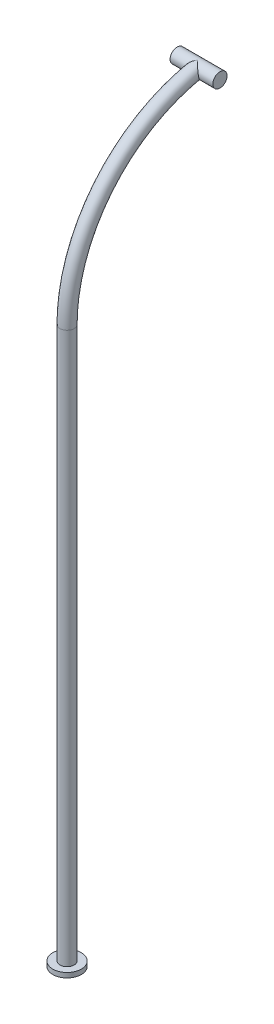
ISO-10303-21;
HEADER;
FILE_DESCRIPTION(('STEP AP214'),'2;1');
FILE_NAME('part.step','',(''),(''),'','','');
FILE_SCHEMA(('AUTOMOTIVE_DESIGN { 1 0 10303 214 1 1 1 1 }'));
ENDSEC;
DATA;
#1=APPLICATION_CONTEXT('core data for automotive mechanical design processes');
#2=APPLICATION_PROTOCOL_DEFINITION('international standard','automotive_design',2000,#1);
#3=PRODUCT_CONTEXT('',#1,'mechanical');
#4=PRODUCT('Part','Part','',(#3));
#5=PRODUCT_RELATED_PRODUCT_CATEGORY('part','',(#4));
#6=PRODUCT_DEFINITION_FORMATION('','',#4);
#7=PRODUCT_DEFINITION_CONTEXT('part definition',#1,'design');
#8=PRODUCT_DEFINITION('design','',#6,#7);
#9=PRODUCT_DEFINITION_SHAPE('','',#8);
#10=(LENGTH_UNIT() NAMED_UNIT(*) SI_UNIT(.MILLI.,.METRE.));
#11=(NAMED_UNIT(*) PLANE_ANGLE_UNIT() SI_UNIT($,.RADIAN.));
#12=(NAMED_UNIT(*) SI_UNIT($,.STERADIAN.) SOLID_ANGLE_UNIT());
#13=UNCERTAINTY_MEASURE_WITH_UNIT(LENGTH_MEASURE(1.E-05),#10,'distance_accuracy_value','');
#14=(GEOMETRIC_REPRESENTATION_CONTEXT(3) GLOBAL_UNCERTAINTY_ASSIGNED_CONTEXT((#13)) GLOBAL_UNIT_ASSIGNED_CONTEXT((#10,
#11,#12)) REPRESENTATION_CONTEXT('',''));
#15=CARTESIAN_POINT('',(0.,0.,0.));
#16=DIRECTION('',(0.,0.,1.));
#17=DIRECTION('',(1.,0.,0.));
#18=AXIS2_PLACEMENT_3D('',#15,#16,#17);
#19=CARTESIAN_POINT('',(0.,116.,0.));
#20=DIRECTION('',(0.,-1.,0.));
#21=DIRECTION('',(0.,0.,-1.));
#22=AXIS2_PLACEMENT_3D('',#19,#20,#21);
#23=CYLINDRICAL_SURFACE('',#22,1.5);
#24=CARTESIAN_POINT('',(0.,116.,0.));
#25=DIRECTION('',(0.,1.,0.));
#26=DIRECTION('',(0.,0.,1.));
#27=AXIS2_PLACEMENT_3D('',#24,#25,#26);
#28=CIRCLE('',#27,1.5);
#29=CARTESIAN_POINT('',(0.,116.,-1.5));
#30=VERTEX_POINT('',#29);
#31=EDGE_CURVE('E11',#30,#30,#28,.T.);
#32=CARTESIAN_POINT('',(0.,0.,0.));
#33=DIRECTION('',(0.,1.,0.));
#34=DIRECTION('',(0.,0.,1.));
#35=AXIS2_PLACEMENT_3D('',#32,#33,#34);
#36=CIRCLE('',#35,1.5);
#37=CARTESIAN_POINT('',(0.,0.,-1.5));
#38=VERTEX_POINT('',#37);
#39=EDGE_CURVE('E35',#38,#38,#36,.T.);
#40=CARTESIAN_POINT('',(0.,116.,-1.5));
#41=CARTESIAN_POINT('',(0.,114.791666666667,-1.5));
#42=CARTESIAN_POINT('',(0.,113.583333333333,-1.5));
#43=CARTESIAN_POINT('',(0.,111.166666666667,-1.5));
#44=CARTESIAN_POINT('',(0.,109.958333333333,-1.5));
#45=CARTESIAN_POINT('',(0.,107.541666666667,-1.5));
#46=CARTESIAN_POINT('',(0.,106.333333333333,-1.5));
#47=CARTESIAN_POINT('',(0.,103.916666666667,-1.5));
#48=CARTESIAN_POINT('',(0.,102.708333333333,-1.5));
#49=CARTESIAN_POINT('',(0.,100.291666666667,-1.5));
#50=CARTESIAN_POINT('',(0.,99.0833333333333,-1.5));
#51=CARTESIAN_POINT('',(0.,96.6666666666667,-1.5));
#52=CARTESIAN_POINT('',(0.,95.4583333333333,-1.5));
#53=CARTESIAN_POINT('',(0.,93.0416666666667,-1.5));
#54=CARTESIAN_POINT('',(0.,91.8333333333333,-1.5));
#55=CARTESIAN_POINT('',(0.,89.4166666666667,-1.5));
#56=CARTESIAN_POINT('',(0.,88.2083333333333,-1.5));
#57=CARTESIAN_POINT('',(0.,85.7916666666667,-1.5));
#58=CARTESIAN_POINT('',(0.,84.5833333333333,-1.5));
#59=CARTESIAN_POINT('',(0.,82.1666666666667,-1.5));
#60=CARTESIAN_POINT('',(0.,80.9583333333333,-1.5));
#61=CARTESIAN_POINT('',(0.,78.5416666666667,-1.5));
#62=CARTESIAN_POINT('',(0.,77.3333333333333,-1.5));
#63=CARTESIAN_POINT('',(0.,74.9166666666667,-1.5));
#64=CARTESIAN_POINT('',(0.,73.7083333333333,-1.5));
#65=CARTESIAN_POINT('',(0.,71.2916666666667,-1.5));
#66=CARTESIAN_POINT('',(0.,70.0833333333333,-1.5));
#67=CARTESIAN_POINT('',(0.,67.6666666666667,-1.5));
#68=CARTESIAN_POINT('',(0.,66.4583333333333,-1.5));
#69=CARTESIAN_POINT('',(0.,64.0416666666667,-1.5));
#70=CARTESIAN_POINT('',(0.,62.8333333333333,-1.5));
#71=CARTESIAN_POINT('',(0.,60.4166666666667,-1.5));
#72=CARTESIAN_POINT('',(0.,59.2083333333333,-1.5));
#73=CARTESIAN_POINT('',(0.,56.7916666666667,-1.5));
#74=CARTESIAN_POINT('',(0.,55.5833333333333,-1.5));
#75=CARTESIAN_POINT('',(0.,53.1666666666667,-1.5));
#76=CARTESIAN_POINT('',(0.,51.9583333333333,-1.5));
#77=CARTESIAN_POINT('',(0.,49.5416666666667,-1.5));
#78=CARTESIAN_POINT('',(0.,48.3333333333333,-1.5));
#79=CARTESIAN_POINT('',(0.,45.9166666666667,-1.5));
#80=CARTESIAN_POINT('',(0.,44.7083333333333,-1.5));
#81=CARTESIAN_POINT('',(0.,42.2916666666667,-1.5));
#82=CARTESIAN_POINT('',(0.,41.0833333333333,-1.5));
#83=CARTESIAN_POINT('',(0.,38.6666666666667,-1.5));
#84=CARTESIAN_POINT('',(0.,37.4583333333333,-1.5));
#85=CARTESIAN_POINT('',(0.,35.0416666666667,-1.5));
#86=CARTESIAN_POINT('',(0.,33.8333333333333,-1.5));
#87=CARTESIAN_POINT('',(0.,31.4166666666667,-1.5));
#88=CARTESIAN_POINT('',(0.,30.2083333333333,-1.5));
#89=CARTESIAN_POINT('',(0.,27.7916666666667,-1.5));
#90=CARTESIAN_POINT('',(0.,26.5833333333333,-1.5));
#91=CARTESIAN_POINT('',(0.,24.1666666666667,-1.5));
#92=CARTESIAN_POINT('',(0.,22.9583333333333,-1.5));
#93=CARTESIAN_POINT('',(0.,20.5416666666667,-1.5));
#94=CARTESIAN_POINT('',(0.,19.3333333333333,-1.5));
#95=CARTESIAN_POINT('',(0.,16.9166666666667,-1.5));
#96=CARTESIAN_POINT('',(0.,15.7083333333333,-1.5));
#97=CARTESIAN_POINT('',(0.,13.2916666666667,-1.5));
#98=CARTESIAN_POINT('',(0.,12.0833333333333,-1.5));
#99=CARTESIAN_POINT('',(0.,9.66666666666667,-1.5));
#100=CARTESIAN_POINT('',(0.,8.45833333333334,-1.5));
#101=CARTESIAN_POINT('',(0.,6.04166666666667,-1.5));
#102=CARTESIAN_POINT('',(0.,4.83333333333334,-1.5));
#103=CARTESIAN_POINT('',(0.,2.41666666666667,-1.5));
#104=CARTESIAN_POINT('',(0.,1.20833333333333,-1.5));
#105=CARTESIAN_POINT('',(0.,0.,-1.5));
#106=B_SPLINE_CURVE_WITH_KNOTS('',3,(#40,#41,#42,#43,#44,#45,#46,#47,#48,#49,#50,#51,#52,#53,
#54,#55,#56,#57,#58,#59,#60,#61,#62,#63,#64,#65,#66,#67,#68,#69,#70,#71,#72,#73,#74,#75,#76,#77,
#78,#79,#80,#81,#82,#83,#84,#85,#86,#87,#88,#89,#90,#91,#92,#93,#94,#95,#96,#97,#98,#99,#100,
#101,#102,#103,#104,#105),.UNSPECIFIED.,.F.,.F.,(4,2,2,2,2,2,2,2,2,2,2,2,2,2,2,2,2,2,2,2,2,2,2,
2,2,2,2,2,2,2,2,2,4),(0.,3.625,7.25000000000001,10.875,14.5,18.125,21.75,25.375,29.,32.625,
36.25,39.875,43.5,47.125,50.75,54.375,58.,61.625,65.25,68.875,72.5,76.125,79.75,83.375,87.,
90.625,94.25,97.875,101.5,105.125,108.75,112.375,116.),.UNSPECIFIED.);
#107=EDGE_CURVE('BSEAM32',#30,#38,#106,.T.);
#108=ORIENTED_EDGE('',*,*,#31,.F.);
#109=ORIENTED_EDGE('',*,*,#39,.T.);
#110=ORIENTED_EDGE('',*,*,#107,.T.);
#111=ORIENTED_EDGE('',*,*,#107,.F.);
#112=EDGE_LOOP('',(#108,#110,#109,#111));
#113=FACE_BOUND('',#112,.T.);
#114=ADVANCED_FACE('F32',(#113),#23,.T.);
#115=CARTESIAN_POINT('',(0.,-1.,0.));
#116=DIRECTION('',(0.,1.,0.));
#117=DIRECTION('',(0.,0.,1.));
#118=AXIS2_PLACEMENT_3D('',#115,#116,#117);
#119=CYLINDRICAL_SURFACE('',#118,3.);
#120=CARTESIAN_POINT('',(0.,-1.,0.));
#121=DIRECTION('',(0.,-1.,0.));
#122=DIRECTION('',(0.,0.,-1.));
#123=AXIS2_PLACEMENT_3D('',#120,#121,#122);
#124=CIRCLE('',#123,3.);
#125=CARTESIAN_POINT('',(0.,-1.,-3.));
#126=VERTEX_POINT('',#125);
#127=EDGE_CURVE('E57',#126,#126,#124,.T.);
#128=ORIENTED_EDGE('',*,*,#127,.F.);
#129=EDGE_LOOP('',(#128));
#130=FACE_BOUND('',#129,.T.);
#131=CARTESIAN_POINT('',(0.,0.,0.));
#132=DIRECTION('',(0.,-1.,0.));
#133=DIRECTION('',(0.,0.,-1.));
#134=AXIS2_PLACEMENT_3D('',#131,#132,#133);
#135=CIRCLE('',#134,3.);
#136=CARTESIAN_POINT('',(0.,0.,-3.));
#137=VERTEX_POINT('',#136);
#138=EDGE_CURVE('E54',#137,#137,#135,.T.);
#139=ORIENTED_EDGE('',*,*,#138,.T.);
#140=EDGE_LOOP('',(#139));
#141=FACE_BOUND('',#140,.T.);
#142=ADVANCED_FACE('F87',(#130,#141),#119,.T.);
#143=CARTESIAN_POINT('',(0.,-1.,0.));
#144=DIRECTION('',(0.,-1.,0.));
#145=DIRECTION('',(0.,0.,-1.));
#146=AXIS2_PLACEMENT_3D('',#143,#144,#145);
#147=PLANE('',#146);
#148=ORIENTED_EDGE('',*,*,#127,.T.);
#149=EDGE_LOOP('',(#148));
#150=FACE_BOUND('',#149,.T.);
#151=ADVANCED_FACE('F92',(#150),#147,.T.);
#152=CARTESIAN_POINT('',(0.,0.,0.));
#153=DIRECTION('',(0.,-1.,0.));
#154=DIRECTION('',(0.,0.,-1.));
#155=AXIS2_PLACEMENT_3D('',#152,#153,#154);
#156=PLANE('',#155);
#157=ORIENTED_EDGE('',*,*,#39,.F.);
#158=EDGE_LOOP('',(#157));
#159=FACE_BOUND('',#158,.T.);
#160=ORIENTED_EDGE('',*,*,#138,.F.);
#161=EDGE_LOOP('',(#160));
#162=FACE_BOUND('',#161,.T.);
#163=ADVANCED_FACE('F105',(#159,#162),#156,.F.);
#164=CARTESIAN_POINT('',(0.,116.,-33.5));
#165=DIRECTION('',(1.,0.,0.));
#166=DIRECTION('',(0.,0.,-1.));
#167=AXIS2_PLACEMENT_3D('',#164,#165,#166);
#168=TOROIDAL_SURFACE('',#167,33.5,1.5);
#169=CARTESIAN_POINT('',(0.,150.468271355427,-27.4223137816575));
#170=CARTESIAN_POINT('',(-0.0018455700807971,150.467943771681,-27.4204560058939));
#171=CARTESIAN_POINT('',(-0.00369119618615408,150.467612681176,-27.418598790246));
#172=CARTESIAN_POINT('',(-0.11723675298671,150.447028324668,-27.3043782216821));
#173=CARTESIAN_POINT('',(-0.229114545353066,150.413934769553,-27.1940972541607));
#174=CARTESIAN_POINT('',(-0.450167280180578,150.321985418649,-26.9812724865205));
#175=CARTESIAN_POINT('',(-0.559335695353365,150.263072789314,-26.8787463436305));
#176=CARTESIAN_POINT('',(-0.741816339629492,150.138437283195,-26.7126643590827));
#177=CARTESIAN_POINT('',(-0.816740553529646,150.079030491823,-26.6461399004851));
#178=CARTESIAN_POINT('',(-0.960834204534878,149.945645295398,-26.5221694214755));
#179=CARTESIAN_POINT('',(-1.0300161261433,149.871699746004,-26.4647034481776));
#180=CARTESIAN_POINT('',(-1.14273518511408,149.730028512423,-26.3754993125735));
#181=CARTESIAN_POINT('',(-1.18826908749948,149.665666180124,-26.3409542883607));
#182=CARTESIAN_POINT('',(-1.27266401355297,149.528928810461,-26.2805509156627));
#183=CARTESIAN_POINT('',(-1.31153339372175,149.456563997418,-26.2546816493207));
#184=CARTESIAN_POINT('',(-1.37321158242012,149.320304931743,-26.2180316917124));
#185=CARTESIAN_POINT('',(-1.39767927334744,149.257707811747,-26.2052465965705));
#186=CARTESIAN_POINT('',(-1.43953985941923,149.129078400923,-26.1877433182874));
#187=CARTESIAN_POINT('',(-1.45693745222111,149.063048424035,-26.1830197720302));
#188=CARTESIAN_POINT('',(-1.48346461159684,148.928763457495,-26.1825679557935));
#189=CARTESIAN_POINT('',(-1.49253356956041,148.86049584431,-26.1869048849103));
#190=CARTESIAN_POINT('',(-1.50129804899405,148.724622755612,-26.2050515110252));
#191=CARTESIAN_POINT('',(-1.50099879563853,148.657016932031,-26.2188559232768));
#192=CARTESIAN_POINT('',(-1.49157787227115,148.532726366524,-26.2532405987497));
#193=CARTESIAN_POINT('',(-1.48348741594787,148.47568652385,-26.2728448592982));
#194=CARTESIAN_POINT('',(-1.46048849656692,148.365551024773,-26.3181302422252));
#195=CARTESIAN_POINT('',(-1.44557906022225,148.312455932671,-26.3438122318377));
#196=CARTESIAN_POINT('',(-1.40922059833972,148.209559484664,-26.4010538738837));
#197=CARTESIAN_POINT('',(-1.38757698661735,148.15991860127,-26.4327757576798));
#198=CARTESIAN_POINT('',(-1.33901214455985,148.066363504146,-26.5003006615747));
#199=CARTESIAN_POINT('',(-1.31208831928666,148.022452123898,-26.5361056846791));
#200=CARTESIAN_POINT('',(-1.23810795998544,147.918053132926,-26.6311203721736));
#201=CARTESIAN_POINT('',(-1.18807950143996,147.86158563168,-26.6924448961051));
#202=CARTESIAN_POINT('',(-1.08086971168539,147.761769125044,-26.8194203058563));
#203=CARTESIAN_POINT('',(-1.02366946922008,147.718455879489,-26.8850824044393));
#204=CARTESIAN_POINT('',(-0.880243458258788,147.628803488579,-27.0457516762444));
#205=CARTESIAN_POINT('',(-0.791633956613812,147.58832353005,-27.1418880756446));
#206=CARTESIAN_POINT('',(-0.608933600065409,147.528355639259,-27.3352854637372));
#207=CARTESIAN_POINT('',(-0.514839483169954,147.508880336669,-27.4325470935278));
#208=CARTESIAN_POINT('',(-0.351278026015448,147.491836263022,-27.5983272439971));
#209=CARTESIAN_POINT('',(-0.282486170635539,147.489587062431,-27.6670902088788));
#210=CARTESIAN_POINT('',(-0.144296015824541,147.494370639898,-27.8034873341362));
#211=CARTESIAN_POINT('',(-0.0748990069601948,147.501386977978,-27.871123278779));
#212=CARTESIAN_POINT('',(-0.00369302848105099,147.513224541409,-27.9397031814825));
#213=CARTESIAN_POINT('',(-0.00184649713801543,147.513534720144,-27.9414810469467));
#214=CARTESIAN_POINT('',(0.,147.513848096391,-27.9432583146583));
#215=B_SPLINE_CURVE_WITH_KNOTS('',3,(#169,#170,#171,#172,#173,#174,#175,#176,#177,#178,#179,
#180,#181,#182,#183,#184,#185,#186,#187,#188,#189,#190,#191,#192,#193,#194,#195,#196,#197,#198,
#199,#200,#201,#202,#203,#204,#205,#206,#207,#208,#209,#210,#211,#212,#213,#214),.UNSPECIFIED.,
.F.,.F.,(4,2,2,2,2,2,2,2,2,2,2,2,2,2,2,2,2,2,2,2,2,2,4),(0.,0.00791749209999727,
0.487082614778096,0.96730782641132,1.31561813730152,1.66315017769124,1.92052040451129,
2.17756552214118,2.38200785095782,2.58631411709557,2.79209563160859,2.99776237232942,
3.17948418892788,3.36123195115241,3.54881473479254,3.73648993723761,4.0265163370424,
4.31732425781116,4.72572981565765,5.13438080279551,5.4258473390426,5.71679741627866,
5.72454338913383),.UNSPECIFIED.);
#216=CARTESIAN_POINT('',(0.,150.468271355427,-27.4223137816575));
#217=VERTEX_POINT('',#216);
#218=CARTESIAN_POINT('',(0.,147.513848096391,-27.9432583146583));
#219=VERTEX_POINT('',#218);
#220=EDGE_CURVE('E47',#217,#219,#215,.T.);
#221=ORIENTED_EDGE('',*,*,#220,.T.);
#222=CARTESIAN_POINT('',(0.,147.513848096391,-27.9432583146583));
#223=CARTESIAN_POINT('',(0.0018464531636213,147.513534732483,-27.9414810884643));
#224=CARTESIAN_POINT('',(0.00369298482771931,147.513224553499,-27.9397032227249));
#225=CARTESIAN_POINT('',(0.124339664345886,147.493167456668,-27.8235060438266));
#226=CARTESIAN_POINT('',(0.243429358936764,147.486611368485,-27.7064697093279));
#227=CARTESIAN_POINT('',(0.419281094860855,147.497725754174,-27.529633837264));
#228=CARTESIAN_POINT('',(0.477525527230344,147.504950407235,-27.470379105977));
#229=CARTESIAN_POINT('',(0.59256173439493,147.526785695943,-27.3518348200178));
#230=CARTESIAN_POINT('',(0.649354393664904,147.541391716195,-27.2925453102026));
#231=CARTESIAN_POINT('',(0.779559264264115,147.584693518914,-27.1546016703881));
#232=CARTESIAN_POINT('',(0.852161576340586,147.616470992009,-27.0761178562885));
#233=CARTESIAN_POINT('',(0.991398120760106,147.695526874957,-26.9218099852698));
#234=CARTESIAN_POINT('',(1.05804550204984,147.742770001864,-26.8459803051235));
#235=CARTESIAN_POINT('',(1.16657305008167,147.840293809682,-26.7181823981691));
#236=CARTESIAN_POINT('',(1.21045261959584,147.886779988639,-26.6650320912657));
#237=CARTESIAN_POINT('',(1.29131121555191,147.98989534437,-26.5634613673116));
#238=CARTESIAN_POINT('',(1.3282988889806,148.046511633973,-26.5150350601134));
#239=CARTESIAN_POINT('',(1.38661289528443,148.157487641821,-26.4342340343271));
#240=CARTESIAN_POINT('',(1.40959162237487,148.210042499447,-26.4005846773196));
#241=CARTESIAN_POINT('',(1.4483829945195,148.320996280183,-26.3392751544075));
#242=CARTESIAN_POINT('',(1.4642007337524,148.379391012707,-26.3116107382776));
#243=CARTESIAN_POINT('',(1.48765459823308,148.501111572783,-26.2635419664262));
#244=CARTESIAN_POINT('',(1.49524066188499,148.564465087924,-26.2431825320193));
#245=CARTESIAN_POINT('',(1.50147440979303,148.693736749745,-26.2110422317556));
#246=CARTESIAN_POINT('',(1.50012449635727,148.759654202411,-26.1992590612397));
#247=CARTESIAN_POINT('',(1.4892575363322,148.885267016529,-26.1853170707429));
#248=CARTESIAN_POINT('',(1.48054487648359,148.944946113396,-26.1823360150494));
#249=CARTESIAN_POINT('',(1.45664817664342,149.062910520598,-26.1833464835934));
#250=CARTESIAN_POINT('',(1.44146305880287,149.121195597081,-26.1873391695012));
#251=CARTESIAN_POINT('',(1.40446636317129,149.238464215033,-26.2020819647632));
#252=CARTESIAN_POINT('',(1.38232264524451,149.297293577946,-26.2132091356558));
#253=CARTESIAN_POINT('',(1.33290006633376,149.411157373233,-26.2416169118734));
#254=CARTESIAN_POINT('',(1.30561829303529,149.466189629069,-26.2589010120006));
#255=CARTESIAN_POINT('',(1.23093165457258,149.600816134184,-26.3095355472436));
#256=CARTESIAN_POINT('',(1.18065855168603,149.677467383282,-26.3465096272665));
#257=CARTESIAN_POINT('',(1.07322474920916,149.820071157484,-26.4299496642385));
#258=CARTESIAN_POINT('',(1.01604682904675,149.885995929004,-26.4764395627449));
#259=CARTESIAN_POINT('',(0.875437348617189,150.029122075187,-26.5947210428979));
#260=CARTESIAN_POINT('',(0.789984780647424,150.101790670277,-26.6695851310483));
#261=CARTESIAN_POINT('',(0.613981627037371,150.228208028432,-26.8285119161098));
#262=CARTESIAN_POINT('',(0.52342817789593,150.28194603908,-26.9125798052879));
#263=CARTESIAN_POINT('',(0.361513639747116,150.360554037092,-27.0662981580287));
#264=CARTESIAN_POINT('',(0.290706467903815,150.389249624625,-27.1346261765933));
#265=CARTESIAN_POINT('',(0.148428259977776,150.436127801861,-27.273927570059));
#266=CARTESIAN_POINT('',(0.0769587187554034,150.454330015801,-27.3448957410066));
#267=CARTESIAN_POINT('',(0.00369121283488572,150.467612683353,-27.4185987725135));
#268=CARTESIAN_POINT('',(0.0018455866538151,150.467943774064,-27.4204559882025));
#269=CARTESIAN_POINT('',(0.,150.468271355427,-27.4223137816575));
#270=B_SPLINE_CURVE_WITH_KNOTS('',3,(#222,#223,#224,#225,#226,#227,#228,#229,#230,#231,#232,
#233,#234,#235,#236,#237,#238,#239,#240,#241,#242,#243,#244,#245,#246,#247,#248,#249,#250,#251,
#252,#253,#254,#255,#256,#257,#258,#259,#260,#261,#262,#263,#264,#265,#266,#267,#268,#269),
.UNSPECIFIED.,.F.,.F.,(4,2,2,2,2,2,2,2,2,2,2,2,2,2,2,2,2,2,2,2,2,2,2,4),(0.,0.00774597285516229,
0.506078780252799,0.756046703031556,1.00585851983455,1.33940265139592,1.67219108592526,
1.9207591550255,2.16901322421771,2.36771980543343,2.56628480791592,2.76605074596186,
2.96576298200791,3.14611560612234,3.32649827583791,3.51730194655153,3.70821409446726,
4.00308345913844,4.29870403373734,4.70114328808098,5.10381075744405,5.41077168964886,
5.71715667927111,5.72507417137111),.UNSPECIFIED.);
#271=EDGE_CURVE('E45',#219,#217,#270,.T.);
#272=ORIENTED_EDGE('',*,*,#271,.T.);
#273=EDGE_LOOP('',(#221,#272));
#274=FACE_BOUND('',#273,.T.);
#275=ORIENTED_EDGE('',*,*,#31,.T.);
#276=EDGE_LOOP('',(#275));
#277=FACE_BOUND('',#276,.T.);
#278=ADVANCED_FACE('F52',(#274,#277),#168,.T.);
#279=CARTESIAN_POINT('',(-4.5,148.991059725909,-27.6827860481579));
#280=DIRECTION('',(1.,0.,0.));
#281=DIRECTION('',(0.,0.,-1.));
#282=AXIS2_PLACEMENT_3D('',#279,#280,#281);
#283=CYLINDRICAL_SURFACE('',#282,1.5);
#284=CARTESIAN_POINT('',(4.5,148.991059725909,-27.6827860481579));
#285=DIRECTION('',(1.,0.,0.));
#286=DIRECTION('',(0.,0.,-1.));
#287=AXIS2_PLACEMENT_3D('',#284,#285,#286);
#288=CIRCLE('',#287,1.5);
#289=CARTESIAN_POINT('',(4.5,148.991059725909,-29.1827860481579));
#290=VERTEX_POINT('',#289);
#291=EDGE_CURVE('E155',#290,#290,#288,.T.);
#292=ORIENTED_EDGE('',*,*,#291,.F.);
#293=EDGE_LOOP('',(#292));
#294=FACE_BOUND('',#293,.T.);
#295=CARTESIAN_POINT('',(-4.5,148.991059725909,-27.6827860481579));
#296=DIRECTION('',(1.,0.,0.));
#297=DIRECTION('',(0.,0.,-1.));
#298=AXIS2_PLACEMENT_3D('',#295,#296,#297);
#299=CIRCLE('',#298,1.5);
#300=CARTESIAN_POINT('',(-4.5,148.991059725909,-29.1827860481579));
#301=VERTEX_POINT('',#300);
#302=EDGE_CURVE('E50',#301,#301,#299,.T.);
#303=ORIENTED_EDGE('',*,*,#302,.T.);
#304=EDGE_LOOP('',(#303));
#305=FACE_BOUND('',#304,.T.);
#306=ORIENTED_EDGE('',*,*,#271,.F.);
#307=ORIENTED_EDGE('',*,*,#220,.F.);
#308=EDGE_LOOP('',(#306,#307));
#309=FACE_BOUND('',#308,.T.);
#310=ADVANCED_FACE('F48',(#294,#305,#309),#283,.T.);
#311=CARTESIAN_POINT('',(-4.5,148.991059725909,-27.6827860481579));
#312=DIRECTION('',(1.,0.,0.));
#313=DIRECTION('',(0.,0.,-1.));
#314=AXIS2_PLACEMENT_3D('',#311,#312,#313);
#315=PLANE('',#314);
#316=ORIENTED_EDGE('',*,*,#302,.F.);
#317=EDGE_LOOP('',(#316));
#318=FACE_BOUND('',#317,.T.);
#319=ADVANCED_FACE('F74',(#318),#315,.F.);
#320=CARTESIAN_POINT('',(4.5,148.991059725909,-27.6827860481579));
#321=DIRECTION('',(1.,0.,0.));
#322=DIRECTION('',(0.,0.,-1.));
#323=AXIS2_PLACEMENT_3D('',#320,#321,#322);
#324=PLANE('',#323);
#325=ORIENTED_EDGE('',*,*,#291,.T.);
#326=EDGE_LOOP('',(#325));
#327=FACE_BOUND('',#326,.T.);
#328=ADVANCED_FACE('F79',(#327),#324,.T.);
#329=CLOSED_SHELL('',(#114,#142,#151,#163,#278,#310,#319,#328));
#330=MANIFOLD_SOLID_BREP('B2',#329);
#331=ADVANCED_BREP_SHAPE_REPRESENTATION('',(#18,#330),#14);
#332=SHAPE_DEFINITION_REPRESENTATION(#9,#331);
ENDSEC;
END-ISO-10303-21;
